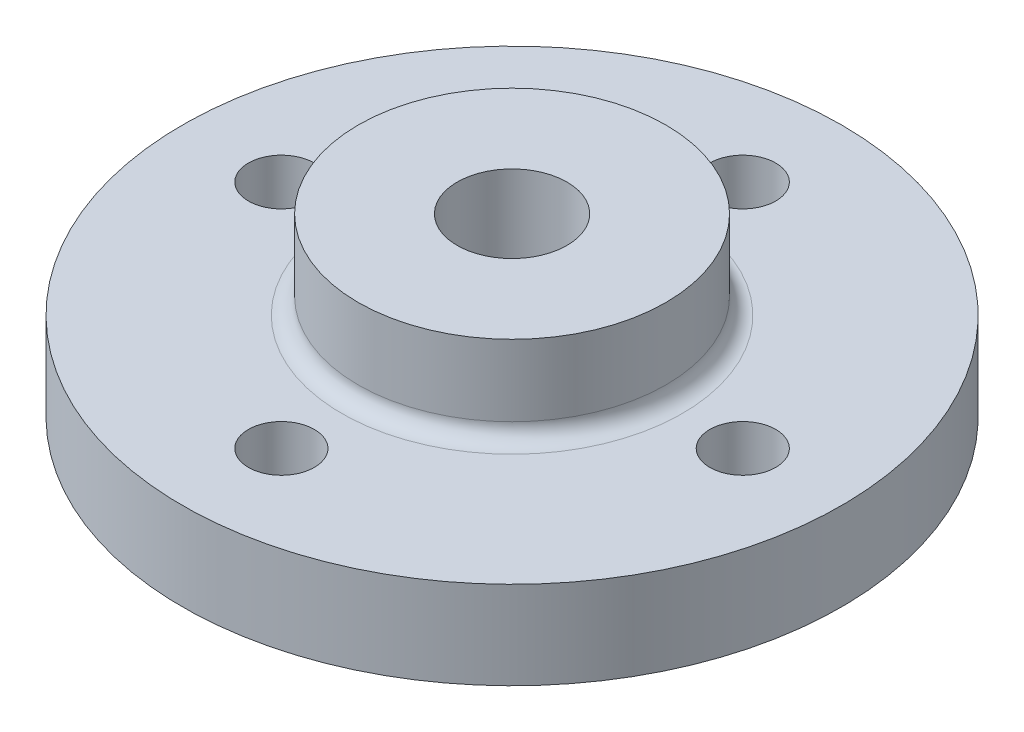
ISO-10303-21;
HEADER;
FILE_DESCRIPTION(('STEP AP214'),'2;1');
FILE_NAME('part.step','',(''),(''),'','','');
FILE_SCHEMA(('AUTOMOTIVE_DESIGN { 1 0 10303 214 1 1 1 1 }'));
ENDSEC;
DATA;
#1=APPLICATION_CONTEXT('core data for automotive mechanical design processes');
#2=APPLICATION_PROTOCOL_DEFINITION('international standard','automotive_design',2000,#1);
#3=PRODUCT_CONTEXT('',#1,'mechanical');
#4=PRODUCT('Part','Part','',(#3));
#5=PRODUCT_RELATED_PRODUCT_CATEGORY('part','',(#4));
#6=PRODUCT_DEFINITION_FORMATION('','',#4);
#7=PRODUCT_DEFINITION_CONTEXT('part definition',#1,'design');
#8=PRODUCT_DEFINITION('design','',#6,#7);
#9=PRODUCT_DEFINITION_SHAPE('','',#8);
#10=(LENGTH_UNIT() NAMED_UNIT(*) SI_UNIT(.MILLI.,.METRE.));
#11=(NAMED_UNIT(*) PLANE_ANGLE_UNIT() SI_UNIT($,.RADIAN.));
#12=(NAMED_UNIT(*) SI_UNIT($,.STERADIAN.) SOLID_ANGLE_UNIT());
#13=UNCERTAINTY_MEASURE_WITH_UNIT(LENGTH_MEASURE(1.E-05),#10,'distance_accuracy_value','');
#14=(GEOMETRIC_REPRESENTATION_CONTEXT(3) GLOBAL_UNCERTAINTY_ASSIGNED_CONTEXT((#13)) GLOBAL_UNIT_ASSIGNED_CONTEXT((#10,
#11,#12)) REPRESENTATION_CONTEXT('',''));
#15=CARTESIAN_POINT('',(0.,0.,0.));
#16=DIRECTION('',(0.,0.,1.));
#17=DIRECTION('',(1.,0.,0.));
#18=AXIS2_PLACEMENT_3D('',#15,#16,#17);
#19=CARTESIAN_POINT('',(-23.,0.,0.));
#20=DIRECTION('',(0.,1.,0.));
#21=DIRECTION('',(0.,0.,1.));
#22=AXIS2_PLACEMENT_3D('',#19,#20,#21);
#23=PLANE('',#22);
#24=CARTESIAN_POINT('',(42.,0.,4.39926648694235E-13));
#25=DIRECTION('',(0.,-1.,0.));
#26=DIRECTION('',(0.,0.,-1.));
#27=AXIS2_PLACEMENT_3D('',#24,#25,#26);
#28=CIRCLE('',#27,5.99999999999998);
#29=CARTESIAN_POINT('',(42.,0.,-5.99999999999954));
#30=VERTEX_POINT('',#29);
#31=EDGE_CURVE('E114',#30,#30,#28,.T.);
#32=ORIENTED_EDGE('',*,*,#31,.F.);
#33=EDGE_LOOP('',(#32));
#34=FACE_BOUND('',#33,.T.);
#35=CARTESIAN_POINT('',(0.,0.,-42.));
#36=DIRECTION('',(0.,-1.,0.));
#37=DIRECTION('',(0.,0.,-1.));
#38=AXIS2_PLACEMENT_3D('',#35,#36,#37);
#39=CIRCLE('',#38,5.99999999999999);
#40=CARTESIAN_POINT('',(0.,0.,-48.));
#41=VERTEX_POINT('',#40);
#42=EDGE_CURVE('E106',#41,#41,#39,.T.);
#43=ORIENTED_EDGE('',*,*,#42,.F.);
#44=EDGE_LOOP('',(#43));
#45=FACE_BOUND('',#44,.T.);
#46=CARTESIAN_POINT('',(-42.,0.,-1.46642216231412E-13));
#47=DIRECTION('',(0.,-1.,0.));
#48=DIRECTION('',(0.,0.,-1.));
#49=AXIS2_PLACEMENT_3D('',#46,#47,#48);
#50=CIRCLE('',#49,5.99999999999998);
#51=CARTESIAN_POINT('',(-42.,0.,-6.00000000000013));
#52=VERTEX_POINT('',#51);
#53=EDGE_CURVE('E98',#52,#52,#50,.T.);
#54=ORIENTED_EDGE('',*,*,#53,.F.);
#55=EDGE_LOOP('',(#54));
#56=FACE_BOUND('',#55,.T.);
#57=CARTESIAN_POINT('',(0.,0.,42.));
#58=DIRECTION('',(0.,-1.,0.));
#59=DIRECTION('',(0.,0.,-1.));
#60=AXIS2_PLACEMENT_3D('',#57,#58,#59);
#61=CIRCLE('',#60,5.99999999999999);
#62=CARTESIAN_POINT('',(0.,0.,36.));
#63=VERTEX_POINT('',#62);
#64=EDGE_CURVE('E90',#63,#63,#61,.T.);
#65=ORIENTED_EDGE('',*,*,#64,.F.);
#66=EDGE_LOOP('',(#65));
#67=FACE_BOUND('',#66,.T.);
#68=CARTESIAN_POINT('',(0.,0.,0.));
#69=DIRECTION('',(0.,-1.,0.));
#70=DIRECTION('',(0.,0.,-1.));
#71=AXIS2_PLACEMENT_3D('',#68,#69,#70);
#72=CIRCLE('',#71,23.);
#73=CARTESIAN_POINT('',(0.,0.,-23.));
#74=VERTEX_POINT('',#73);
#75=EDGE_CURVE('E10',#74,#74,#72,.T.);
#76=ORIENTED_EDGE('',*,*,#75,.F.);
#77=EDGE_LOOP('',(#76));
#78=FACE_BOUND('',#77,.T.);
#79=CARTESIAN_POINT('',(0.,0.,0.));
#80=DIRECTION('',(0.,-1.,0.));
#81=DIRECTION('',(0.,0.,-1.));
#82=AXIS2_PLACEMENT_3D('',#79,#80,#81);
#83=CIRCLE('',#82,60.);
#84=CARTESIAN_POINT('',(0.,0.,-60.));
#85=VERTEX_POINT('',#84);
#86=EDGE_CURVE('E82',#85,#85,#83,.T.);
#87=ORIENTED_EDGE('',*,*,#86,.T.);
#88=EDGE_LOOP('',(#87));
#89=FACE_BOUND('',#88,.T.);
#90=ADVANCED_FACE('F43',(#34,#45,#56,#67,#78,#89),#23,.F.);
#91=CARTESIAN_POINT('',(0.,0.,0.));
#92=DIRECTION('',(0.,-1.,0.));
#93=DIRECTION('',(0.,0.,-1.));
#94=AXIS2_PLACEMENT_3D('',#91,#92,#93);
#95=CYLINDRICAL_SURFACE('',#94,23.);
#96=CARTESIAN_POINT('',(0.,12.,0.));
#97=DIRECTION('',(0.,-1.,0.));
#98=DIRECTION('',(0.,0.,-1.));
#99=AXIS2_PLACEMENT_3D('',#96,#97,#98);
#100=CIRCLE('',#99,23.);
#101=CARTESIAN_POINT('',(0.,12.,-23.));
#102=VERTEX_POINT('',#101);
#103=EDGE_CURVE('E50',#102,#102,#100,.T.);
#104=ORIENTED_EDGE('',*,*,#103,.F.);
#105=EDGE_LOOP('',(#104));
#106=FACE_BOUND('',#105,.T.);
#107=ORIENTED_EDGE('',*,*,#75,.T.);
#108=EDGE_LOOP('',(#107));
#109=FACE_BOUND('',#108,.T.);
#110=ADVANCED_FACE('F124',(#106,#109),#95,.F.);
#111=CARTESIAN_POINT('',(-23.,12.,0.));
#112=DIRECTION('',(0.,1.,0.));
#113=DIRECTION('',(0.,0.,1.));
#114=AXIS2_PLACEMENT_3D('',#111,#112,#113);
#115=PLANE('',#114);
#116=CARTESIAN_POINT('',(0.,12.,0.));
#117=DIRECTION('',(0.,-1.,0.));
#118=DIRECTION('',(0.,0.,-1.));
#119=AXIS2_PLACEMENT_3D('',#116,#117,#118);
#120=CIRCLE('',#119,10.);
#121=CARTESIAN_POINT('',(0.,12.,-10.));
#122=VERTEX_POINT('',#121);
#123=EDGE_CURVE('E55',#122,#122,#120,.T.);
#124=ORIENTED_EDGE('',*,*,#123,.F.);
#125=EDGE_LOOP('',(#124));
#126=FACE_BOUND('',#125,.T.);
#127=ORIENTED_EDGE('',*,*,#103,.T.);
#128=EDGE_LOOP('',(#127));
#129=FACE_BOUND('',#128,.T.);
#130=ADVANCED_FACE('F169',(#126,#129),#115,.F.);
#131=CARTESIAN_POINT('',(0.,0.,0.));
#132=DIRECTION('',(0.,-1.,0.));
#133=DIRECTION('',(0.,0.,-1.));
#134=AXIS2_PLACEMENT_3D('',#131,#132,#133);
#135=CYLINDRICAL_SURFACE('',#134,10.);
#136=CARTESIAN_POINT('',(0.,32.,0.));
#137=DIRECTION('',(0.,-1.,0.));
#138=DIRECTION('',(0.,0.,-1.));
#139=AXIS2_PLACEMENT_3D('',#136,#137,#138);
#140=CIRCLE('',#139,10.);
#141=CARTESIAN_POINT('',(0.,32.,-10.));
#142=VERTEX_POINT('',#141);
#143=EDGE_CURVE('E60',#142,#142,#140,.T.);
#144=ORIENTED_EDGE('',*,*,#143,.F.);
#145=EDGE_LOOP('',(#144));
#146=FACE_BOUND('',#145,.T.);
#147=ORIENTED_EDGE('',*,*,#123,.T.);
#148=EDGE_LOOP('',(#147));
#149=FACE_BOUND('',#148,.T.);
#150=ADVANCED_FACE('F163',(#146,#149),#135,.F.);
#151=CARTESIAN_POINT('',(-28.,32.,0.));
#152=DIRECTION('',(0.,-1.,0.));
#153=DIRECTION('',(0.,0.,-1.));
#154=AXIS2_PLACEMENT_3D('',#151,#152,#153);
#155=PLANE('',#154);
#156=CARTESIAN_POINT('',(0.,32.,0.));
#157=DIRECTION('',(0.,-1.,0.));
#158=DIRECTION('',(0.,0.,-1.));
#159=AXIS2_PLACEMENT_3D('',#156,#157,#158);
#160=CIRCLE('',#159,28.);
#161=CARTESIAN_POINT('',(0.,32.,-28.));
#162=VERTEX_POINT('',#161);
#163=EDGE_CURVE('E66',#162,#162,#160,.T.);
#164=ORIENTED_EDGE('',*,*,#163,.F.);
#165=EDGE_LOOP('',(#164));
#166=FACE_BOUND('',#165,.T.);
#167=ORIENTED_EDGE('',*,*,#143,.T.);
#168=EDGE_LOOP('',(#167));
#169=FACE_BOUND('',#168,.T.);
#170=ADVANCED_FACE('F157',(#166,#169),#155,.F.);
#171=CARTESIAN_POINT('',(0.,0.,0.));
#172=DIRECTION('',(0.,-1.,0.));
#173=DIRECTION('',(0.,0.,-1.));
#174=AXIS2_PLACEMENT_3D('',#171,#172,#173);
#175=CYLINDRICAL_SURFACE('',#174,28.);
#176=CARTESIAN_POINT('',(0.,19.,0.));
#177=DIRECTION('',(0.,-1.,0.));
#178=DIRECTION('',(0.,0.,-1.));
#179=AXIS2_PLACEMENT_3D('',#176,#177,#178);
#180=CIRCLE('',#179,28.);
#181=CARTESIAN_POINT('',(0.,19.,-28.));
#182=VERTEX_POINT('',#181);
#183=EDGE_CURVE('E70',#182,#182,#180,.T.);
#184=ORIENTED_EDGE('',*,*,#183,.F.);
#185=EDGE_LOOP('',(#184));
#186=FACE_BOUND('',#185,.T.);
#187=ORIENTED_EDGE('',*,*,#163,.T.);
#188=EDGE_LOOP('',(#187));
#189=FACE_BOUND('',#188,.T.);
#190=ADVANCED_FACE('F151',(#186,#189),#175,.T.);
#191=CARTESIAN_POINT('',(0.,19.,0.));
#192=DIRECTION('',(0.,-1.,0.));
#193=DIRECTION('',(0.,0.,-1.));
#194=AXIS2_PLACEMENT_3D('',#191,#192,#193);
#195=TOROIDAL_SURFACE('',#194,31.,3.);
#196=CARTESIAN_POINT('',(0.,16.,0.));
#197=DIRECTION('',(0.,-1.,0.));
#198=DIRECTION('',(0.,0.,-1.));
#199=AXIS2_PLACEMENT_3D('',#196,#197,#198);
#200=CIRCLE('',#199,31.);
#201=CARTESIAN_POINT('',(0.,16.,-31.));
#202=VERTEX_POINT('',#201);
#203=EDGE_CURVE('E74',#202,#202,#200,.T.);
#204=ORIENTED_EDGE('',*,*,#203,.F.);
#205=EDGE_LOOP('',(#204));
#206=FACE_BOUND('',#205,.T.);
#207=ORIENTED_EDGE('',*,*,#183,.T.);
#208=EDGE_LOOP('',(#207));
#209=FACE_BOUND('',#208,.T.);
#210=ADVANCED_FACE('F144',(#206,#209),#195,.F.);
#211=CARTESIAN_POINT('',(-60.,16.,0.));
#212=DIRECTION('',(0.,-1.,0.));
#213=DIRECTION('',(0.,0.,-1.));
#214=AXIS2_PLACEMENT_3D('',#211,#212,#213);
#215=PLANE('',#214);
#216=CARTESIAN_POINT('',(42.,16.,4.39926648694235E-13));
#217=DIRECTION('',(0.,-1.,0.));
#218=DIRECTION('',(0.,0.,-1.));
#219=AXIS2_PLACEMENT_3D('',#216,#217,#218);
#220=CIRCLE('',#219,5.99999999999999);
#221=CARTESIAN_POINT('',(42.,16.,-5.99999999999955));
#222=VERTEX_POINT('',#221);
#223=EDGE_CURVE('E110',#222,#222,#220,.T.);
#224=ORIENTED_EDGE('',*,*,#223,.T.);
#225=EDGE_LOOP('',(#224));
#226=FACE_BOUND('',#225,.T.);
#227=CARTESIAN_POINT('',(0.,16.,-42.));
#228=DIRECTION('',(0.,-1.,0.));
#229=DIRECTION('',(0.,0.,-1.));
#230=AXIS2_PLACEMENT_3D('',#227,#228,#229);
#231=CIRCLE('',#230,5.99999999999999);
#232=CARTESIAN_POINT('',(0.,16.,-48.));
#233=VERTEX_POINT('',#232);
#234=EDGE_CURVE('E102',#233,#233,#231,.T.);
#235=ORIENTED_EDGE('',*,*,#234,.T.);
#236=EDGE_LOOP('',(#235));
#237=FACE_BOUND('',#236,.T.);
#238=CARTESIAN_POINT('',(-42.,16.,-1.46642216231412E-13));
#239=DIRECTION('',(0.,-1.,0.));
#240=DIRECTION('',(0.,0.,-1.));
#241=AXIS2_PLACEMENT_3D('',#238,#239,#240);
#242=CIRCLE('',#241,5.99999999999999);
#243=CARTESIAN_POINT('',(-42.,16.,-6.00000000000014));
#244=VERTEX_POINT('',#243);
#245=EDGE_CURVE('E94',#244,#244,#242,.T.);
#246=ORIENTED_EDGE('',*,*,#245,.T.);
#247=EDGE_LOOP('',(#246));
#248=FACE_BOUND('',#247,.T.);
#249=CARTESIAN_POINT('',(0.,16.,42.));
#250=DIRECTION('',(0.,-1.,0.));
#251=DIRECTION('',(0.,0.,-1.));
#252=AXIS2_PLACEMENT_3D('',#249,#250,#251);
#253=CIRCLE('',#252,5.99999999999999);
#254=CARTESIAN_POINT('',(0.,16.,36.));
#255=VERTEX_POINT('',#254);
#256=EDGE_CURVE('E86',#255,#255,#253,.T.);
#257=ORIENTED_EDGE('',*,*,#256,.T.);
#258=EDGE_LOOP('',(#257));
#259=FACE_BOUND('',#258,.T.);
#260=CARTESIAN_POINT('',(0.,16.,0.));
#261=DIRECTION('',(0.,-1.,0.));
#262=DIRECTION('',(0.,0.,-1.));
#263=AXIS2_PLACEMENT_3D('',#260,#261,#262);
#264=CIRCLE('',#263,60.);
#265=CARTESIAN_POINT('',(0.,16.,-60.));
#266=VERTEX_POINT('',#265);
#267=EDGE_CURVE('E78',#266,#266,#264,.T.);
#268=ORIENTED_EDGE('',*,*,#267,.F.);
#269=EDGE_LOOP('',(#268));
#270=FACE_BOUND('',#269,.T.);
#271=ORIENTED_EDGE('',*,*,#203,.T.);
#272=EDGE_LOOP('',(#271));
#273=FACE_BOUND('',#272,.T.);
#274=ADVANCED_FACE('F138',(#226,#237,#248,#259,#270,#273),#215,.F.);
#275=CARTESIAN_POINT('',(0.,0.,0.));
#276=DIRECTION('',(0.,-1.,0.));
#277=DIRECTION('',(0.,0.,-1.));
#278=AXIS2_PLACEMENT_3D('',#275,#276,#277);
#279=CYLINDRICAL_SURFACE('',#278,60.);
#280=ORIENTED_EDGE('',*,*,#86,.F.);
#281=EDGE_LOOP('',(#280));
#282=FACE_BOUND('',#281,.T.);
#283=ORIENTED_EDGE('',*,*,#267,.T.);
#284=EDGE_LOOP('',(#283));
#285=FACE_BOUND('',#284,.T.);
#286=ADVANCED_FACE('F134',(#282,#285),#279,.T.);
#287=CARTESIAN_POINT('',(0.,0.,42.));
#288=DIRECTION('',(0.,-1.,0.));
#289=DIRECTION('',(0.,0.,-1.));
#290=AXIS2_PLACEMENT_3D('',#287,#288,#289);
#291=CYLINDRICAL_SURFACE('',#290,5.99999999999999);
#292=ORIENTED_EDGE('',*,*,#64,.T.);
#293=EDGE_LOOP('',(#292));
#294=FACE_BOUND('',#293,.T.);
#295=ORIENTED_EDGE('',*,*,#256,.F.);
#296=EDGE_LOOP('',(#295));
#297=FACE_BOUND('',#296,.T.);
#298=ADVANCED_FACE('F137',(#294,#297),#291,.F.);
#299=CARTESIAN_POINT('',(-42.,0.,-1.46642216231412E-13));
#300=DIRECTION('',(0.,-1.,0.));
#301=DIRECTION('',(0.,0.,-1.));
#302=AXIS2_PLACEMENT_3D('',#299,#300,#301);
#303=CYLINDRICAL_SURFACE('',#302,5.99999999999999);
#304=ORIENTED_EDGE('',*,*,#53,.T.);
#305=EDGE_LOOP('',(#304));
#306=FACE_BOUND('',#305,.T.);
#307=ORIENTED_EDGE('',*,*,#245,.F.);
#308=EDGE_LOOP('',(#307));
#309=FACE_BOUND('',#308,.T.);
#310=ADVANCED_FACE('F182',(#306,#309),#303,.F.);
#311=CARTESIAN_POINT('',(0.,0.,-42.));
#312=DIRECTION('',(0.,-1.,0.));
#313=DIRECTION('',(0.,0.,-1.));
#314=AXIS2_PLACEMENT_3D('',#311,#312,#313);
#315=CYLINDRICAL_SURFACE('',#314,5.99999999999999);
#316=ORIENTED_EDGE('',*,*,#42,.T.);
#317=EDGE_LOOP('',(#316));
#318=FACE_BOUND('',#317,.T.);
#319=ORIENTED_EDGE('',*,*,#234,.F.);
#320=EDGE_LOOP('',(#319));
#321=FACE_BOUND('',#320,.T.);
#322=ADVANCED_FACE('F186',(#318,#321),#315,.F.);
#323=CARTESIAN_POINT('',(42.,0.,4.39926648694235E-13));
#324=DIRECTION('',(0.,-1.,0.));
#325=DIRECTION('',(0.,0.,-1.));
#326=AXIS2_PLACEMENT_3D('',#323,#324,#325);
#327=CYLINDRICAL_SURFACE('',#326,5.99999999999999);
#328=ORIENTED_EDGE('',*,*,#31,.T.);
#329=EDGE_LOOP('',(#328));
#330=FACE_BOUND('',#329,.T.);
#331=ORIENTED_EDGE('',*,*,#223,.F.);
#332=EDGE_LOOP('',(#331));
#333=FACE_BOUND('',#332,.T.);
#334=ADVANCED_FACE('F119',(#330,#333),#327,.F.);
#335=CLOSED_SHELL('',(#90,#110,#130,#150,#170,#190,#210,#274,#286,#298,#310,#322,#334));
#336=MANIFOLD_SOLID_BREP('B2',#335);
#337=ADVANCED_BREP_SHAPE_REPRESENTATION('',(#18,#336),#14);
#338=SHAPE_DEFINITION_REPRESENTATION(#9,#337);
ENDSEC;
END-ISO-10303-21;
